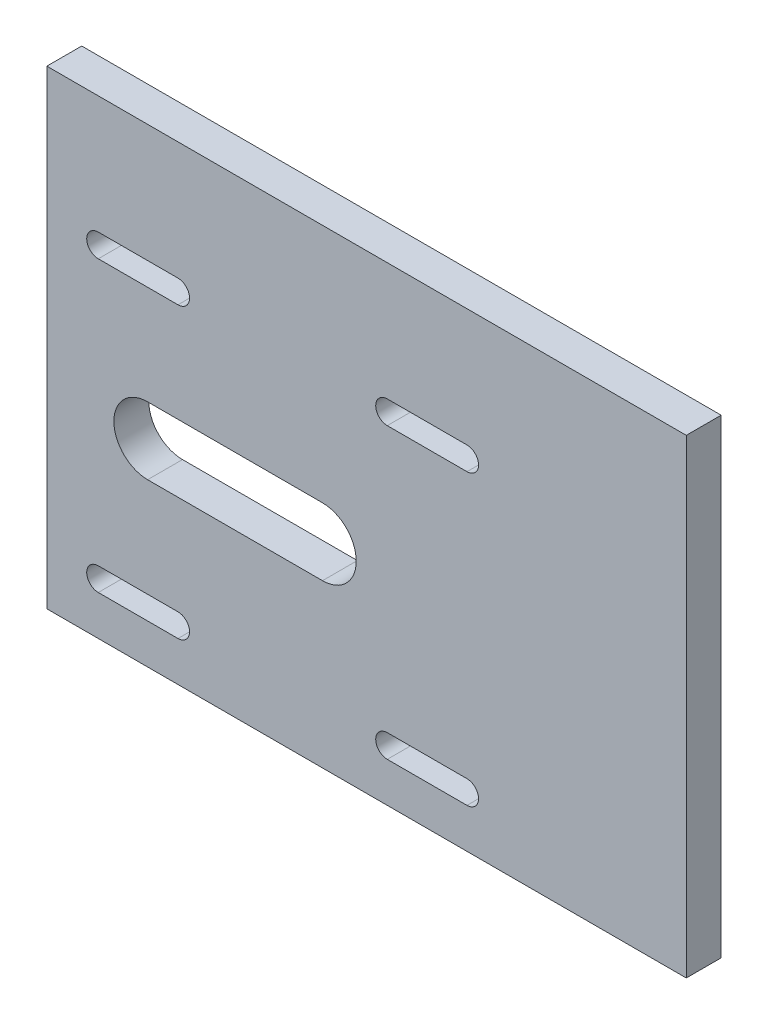
ISO-10303-21;
HEADER;
FILE_DESCRIPTION(('STEP AP214'),'2;1');
FILE_NAME('part.step','',(''),(''),'','','');
FILE_SCHEMA(('AUTOMOTIVE_DESIGN { 1 0 10303 214 1 1 1 1 }'));
ENDSEC;
DATA;
#1=APPLICATION_CONTEXT('core data for automotive mechanical design processes');
#2=APPLICATION_PROTOCOL_DEFINITION('international standard','automotive_design',2000,#1);
#3=PRODUCT_CONTEXT('',#1,'mechanical');
#4=PRODUCT('Part','Part','',(#3));
#5=PRODUCT_RELATED_PRODUCT_CATEGORY('part','',(#4));
#6=PRODUCT_DEFINITION_FORMATION('','',#4);
#7=PRODUCT_DEFINITION_CONTEXT('part definition',#1,'design');
#8=PRODUCT_DEFINITION('design','',#6,#7);
#9=PRODUCT_DEFINITION_SHAPE('','',#8);
#10=(LENGTH_UNIT() NAMED_UNIT(*) SI_UNIT(.MILLI.,.METRE.));
#11=(NAMED_UNIT(*) PLANE_ANGLE_UNIT() SI_UNIT($,.RADIAN.));
#12=(NAMED_UNIT(*) SI_UNIT($,.STERADIAN.) SOLID_ANGLE_UNIT());
#13=UNCERTAINTY_MEASURE_WITH_UNIT(LENGTH_MEASURE(1.E-05),#10,'distance_accuracy_value','');
#14=(GEOMETRIC_REPRESENTATION_CONTEXT(3) GLOBAL_UNCERTAINTY_ASSIGNED_CONTEXT((#13)) GLOBAL_UNIT_ASSIGNED_CONTEXT((#10,
#11,#12)) REPRESENTATION_CONTEXT('',''));
#15=CARTESIAN_POINT('',(0.,0.,0.));
#16=DIRECTION('',(0.,0.,1.));
#17=DIRECTION('',(1.,0.,0.));
#18=AXIS2_PLACEMENT_3D('',#15,#16,#17);
#19=CARTESIAN_POINT('',(0.,0.,11.1125));
#20=DIRECTION('',(0.,0.,-1.));
#21=DIRECTION('',(-1.,0.,0.));
#22=AXIS2_PLACEMENT_3D('',#19,#20,#21);
#23=PLANE('',#22);
#24=CARTESIAN_POINT('',(-150.699186737355,-101.903813262693,11.1125));
#25=DIRECTION('',(0.,0.,1.));
#26=DIRECTION('',(1.,0.,0.));
#27=AXIS2_PLACEMENT_3D('',#24,#25,#26);
#28=CIRCLE('',#27,3.68300000000001);
#29=CARTESIAN_POINT('',(-150.699186737355,-105.586813262693,11.1125));
#30=VERTEX_POINT('',#29);
#31=CARTESIAN_POINT('',(-150.699186737355,-98.2208132626931,11.1125));
#32=VERTEX_POINT('',#31);
#33=EDGE_CURVE('E236',#30,#32,#28,.T.);
#34=ORIENTED_EDGE('',*,*,#33,.F.);
#35=DIRECTION('',(1.,0.,0.));
#36=VECTOR('',#35,1.);
#37=CARTESIAN_POINT('',(-150.699186737355,-105.586813262693,11.1125));
#38=LINE('',#37,#36);
#39=CARTESIAN_POINT('',(-176.099186737355,-105.586813262693,11.1125));
#40=VERTEX_POINT('',#39);
#41=EDGE_CURVE('E244',#40,#30,#38,.T.);
#42=ORIENTED_EDGE('',*,*,#41,.F.);
#43=CARTESIAN_POINT('',(-176.099186737355,-101.903813262693,11.1125));
#44=DIRECTION('',(0.,0.,1.));
#45=DIRECTION('',(1.,0.,0.));
#46=AXIS2_PLACEMENT_3D('',#43,#44,#45);
#47=CIRCLE('',#46,3.68300000000001);
#48=CARTESIAN_POINT('',(-176.099186737355,-98.2208132626931,11.1125));
#49=VERTEX_POINT('',#48);
#50=EDGE_CURVE('E241',#49,#40,#47,.T.);
#51=ORIENTED_EDGE('',*,*,#50,.F.);
#52=DIRECTION('',(-1.,0.,0.));
#53=VECTOR('',#52,1.);
#54=CARTESIAN_POINT('',(-150.699186737355,-98.2208132626931,11.1125));
#55=LINE('',#54,#53);
#56=EDGE_CURVE('E238',#32,#49,#55,.T.);
#57=ORIENTED_EDGE('',*,*,#56,.F.);
#58=EDGE_LOOP('',(#34,#42,#51,#57));
#59=FACE_BOUND('',#58,.T.);
#60=CARTESIAN_POINT('',(-242.774186737355,-9.82881326269314,11.1125));
#61=DIRECTION('',(0.,0.,1.));
#62=DIRECTION('',(1.,0.,0.));
#63=AXIS2_PLACEMENT_3D('',#60,#61,#62);
#64=CIRCLE('',#63,3.68300000000002);
#65=CARTESIAN_POINT('',(-242.774186737355,-13.5118132626932,11.1125));
#66=VERTEX_POINT('',#65);
#67=CARTESIAN_POINT('',(-242.774186737355,-6.14581326269312,11.1125));
#68=VERTEX_POINT('',#67);
#69=EDGE_CURVE('E298',#66,#68,#64,.T.);
#70=ORIENTED_EDGE('',*,*,#69,.F.);
#71=DIRECTION('',(1.,0.,0.));
#72=VECTOR('',#71,1.);
#73=CARTESIAN_POINT('',(-242.774186737355,-13.5118132626932,11.1125));
#74=LINE('',#73,#72);
#75=CARTESIAN_POINT('',(-268.174186737355,-13.5118132626932,11.1125));
#76=VERTEX_POINT('',#75);
#77=EDGE_CURVE('E306',#76,#66,#74,.T.);
#78=ORIENTED_EDGE('',*,*,#77,.F.);
#79=CARTESIAN_POINT('',(-268.174186737355,-9.82881326269315,11.1125));
#80=DIRECTION('',(0.,0.,1.));
#81=DIRECTION('',(1.,0.,0.));
#82=AXIS2_PLACEMENT_3D('',#79,#80,#81);
#83=CIRCLE('',#82,3.68300000000002);
#84=CARTESIAN_POINT('',(-268.174186737355,-6.14581326269313,11.1125));
#85=VERTEX_POINT('',#84);
#86=EDGE_CURVE('E303',#85,#76,#83,.T.);
#87=ORIENTED_EDGE('',*,*,#86,.F.);
#88=DIRECTION('',(-1.,0.,0.));
#89=VECTOR('',#88,1.);
#90=CARTESIAN_POINT('',(-242.774186737355,-6.14581326269312,11.1125));
#91=LINE('',#90,#89);
#92=EDGE_CURVE('E300',#68,#85,#91,.T.);
#93=ORIENTED_EDGE('',*,*,#92,.F.);
#94=EDGE_LOOP('',(#70,#78,#87,#93));
#95=FACE_BOUND('',#94,.T.);
#96=DIRECTION('',(0.,1.,0.));
#97=VECTOR('',#96,1.);
#98=CARTESIAN_POINT('',(-80.8354999999961,31.4461867373068,11.1125));
#99=LINE('',#98,#97);
#100=CARTESIAN_POINT('',(-80.8354999999961,-118.286813262693,11.1125));
#101=VERTEX_POINT('',#100);
#102=CARTESIAN_POINT('',(-80.8354999999961,31.4461867373068,11.1125));
#103=VERTEX_POINT('',#102);
#104=EDGE_CURVE('E360',#101,#103,#99,.T.);
#105=ORIENTED_EDGE('',*,*,#104,.T.);
#106=DIRECTION('',(-1.,0.,0.));
#107=VECTOR('',#106,1.);
#108=CARTESIAN_POINT('',(-80.8354999999961,31.4461867373068,11.1125));
#109=LINE('',#108,#107);
#110=CARTESIAN_POINT('',(-284.557186737355,31.4461867373068,11.1125));
#111=VERTEX_POINT('',#110);
#112=EDGE_CURVE('E363',#103,#111,#109,.T.);
#113=ORIENTED_EDGE('',*,*,#112,.T.);
#114=DIRECTION('',(0.,-1.,0.));
#115=VECTOR('',#114,1.);
#116=CARTESIAN_POINT('',(-284.557186737355,31.4461867373068,11.1125));
#117=LINE('',#116,#115);
#118=CARTESIAN_POINT('',(-284.557186737355,-118.286813262693,11.1125));
#119=VERTEX_POINT('',#118);
#120=EDGE_CURVE('E366',#111,#119,#117,.T.);
#121=ORIENTED_EDGE('',*,*,#120,.T.);
#122=DIRECTION('',(1.,0.,0.));
#123=VECTOR('',#122,1.);
#124=CARTESIAN_POINT('',(-80.8354999999961,-118.286813262693,11.1125));
#125=LINE('',#124,#123);
#126=EDGE_CURVE('E368',#119,#101,#125,.T.);
#127=ORIENTED_EDGE('',*,*,#126,.T.);
#128=EDGE_LOOP('',(#105,#113,#121,#127));
#129=FACE_BOUND('',#128,.T.);
#130=CARTESIAN_POINT('',(-242.774186737355,-101.903813262693,11.1125));
#131=DIRECTION('',(0.,0.,1.));
#132=DIRECTION('',(1.,0.,0.));
#133=AXIS2_PLACEMENT_3D('',#130,#131,#132);
#134=CIRCLE('',#133,3.68300000000003);
#135=CARTESIAN_POINT('',(-242.774186737355,-105.586813262693,11.1125));
#136=VERTEX_POINT('',#135);
#137=CARTESIAN_POINT('',(-242.774186737355,-98.2208132626931,11.1125));
#138=VERTEX_POINT('',#137);
#139=EDGE_CURVE('E329',#136,#138,#134,.T.);
#140=ORIENTED_EDGE('',*,*,#139,.F.);
#141=DIRECTION('',(1.,0.,0.));
#142=VECTOR('',#141,1.);
#143=CARTESIAN_POINT('',(-242.774186737355,-105.586813262693,11.1125));
#144=LINE('',#143,#142);
#145=CARTESIAN_POINT('',(-268.174186737355,-105.586813262693,11.1125));
#146=VERTEX_POINT('',#145);
#147=EDGE_CURVE('E337',#146,#136,#144,.T.);
#148=ORIENTED_EDGE('',*,*,#147,.F.);
#149=CARTESIAN_POINT('',(-268.174186737355,-101.903813262693,11.1125));
#150=DIRECTION('',(0.,0.,1.));
#151=DIRECTION('',(1.,0.,0.));
#152=AXIS2_PLACEMENT_3D('',#149,#150,#151);
#153=CIRCLE('',#152,3.68300000000001);
#154=CARTESIAN_POINT('',(-268.174186737355,-98.2208132626932,11.1125));
#155=VERTEX_POINT('',#154);
#156=EDGE_CURVE('E334',#155,#146,#153,.T.);
#157=ORIENTED_EDGE('',*,*,#156,.F.);
#158=DIRECTION('',(-1.,0.,0.));
#159=VECTOR('',#158,1.);
#160=CARTESIAN_POINT('',(-242.774186737355,-98.2208132626931,11.1125));
#161=LINE('',#160,#159);
#162=EDGE_CURVE('E331',#138,#155,#161,.T.);
#163=ORIENTED_EDGE('',*,*,#162,.F.);
#164=EDGE_LOOP('',(#140,#148,#157,#163));
#165=FACE_BOUND('',#164,.T.);
#166=CARTESIAN_POINT('',(-150.699186737355,-9.82881326269314,11.1125));
#167=DIRECTION('',(0.,0.,1.));
#168=DIRECTION('',(1.,0.,0.));
#169=AXIS2_PLACEMENT_3D('',#166,#167,#168);
#170=CIRCLE('',#169,3.68300000000002);
#171=CARTESIAN_POINT('',(-150.699186737355,-13.5118132626931,11.1125));
#172=VERTEX_POINT('',#171);
#173=CARTESIAN_POINT('',(-150.699186737355,-6.14581326269311,11.1125));
#174=VERTEX_POINT('',#173);
#175=EDGE_CURVE('E267',#172,#174,#170,.T.);
#176=ORIENTED_EDGE('',*,*,#175,.F.);
#177=DIRECTION('',(1.,0.,0.));
#178=VECTOR('',#177,1.);
#179=CARTESIAN_POINT('',(-150.699186737355,-13.5118132626931,11.1125));
#180=LINE('',#179,#178);
#181=CARTESIAN_POINT('',(-176.099186737355,-13.5118132626932,11.1125));
#182=VERTEX_POINT('',#181);
#183=EDGE_CURVE('E275',#182,#172,#180,.T.);
#184=ORIENTED_EDGE('',*,*,#183,.F.);
#185=CARTESIAN_POINT('',(-176.099186737355,-9.82881326269313,11.1125));
#186=DIRECTION('',(0.,0.,1.));
#187=DIRECTION('',(1.,0.,0.));
#188=AXIS2_PLACEMENT_3D('',#185,#186,#187);
#189=CIRCLE('',#188,3.68300000000002);
#190=CARTESIAN_POINT('',(-176.099186737355,-6.14581326269311,11.1125));
#191=VERTEX_POINT('',#190);
#192=EDGE_CURVE('E272',#191,#182,#189,.T.);
#193=ORIENTED_EDGE('',*,*,#192,.F.);
#194=DIRECTION('',(-1.,0.,0.));
#195=VECTOR('',#194,1.);
#196=CARTESIAN_POINT('',(-150.699186737355,-6.14581326269311,11.1125));
#197=LINE('',#196,#195);
#198=EDGE_CURVE('E269',#174,#191,#197,.T.);
#199=ORIENTED_EDGE('',*,*,#198,.F.);
#200=EDGE_LOOP('',(#176,#184,#193,#199));
#201=FACE_BOUND('',#200,.T.);
#202=CARTESIAN_POINT('',(-196.736686737355,-55.8663132626931,11.1125));
#203=DIRECTION('',(0.,0.,1.));
#204=DIRECTION('',(1.,0.,0.));
#205=AXIS2_PLACEMENT_3D('',#202,#203,#204);
#206=CIRCLE('',#205,10.7443561698254);
#207=CARTESIAN_POINT('',(-196.736686737355,-66.6106694325185,11.1125));
#208=VERTEX_POINT('',#207);
#209=CARTESIAN_POINT('',(-196.736686737355,-45.1219570928678,11.1125));
#210=VERTEX_POINT('',#209);
#211=EDGE_CURVE('E200',#208,#210,#206,.T.);
#212=ORIENTED_EDGE('',*,*,#211,.F.);
#213=DIRECTION('',(1.,0.,0.));
#214=VECTOR('',#213,1.);
#215=CARTESIAN_POINT('',(-196.736686737355,-66.6106694325185,11.1125));
#216=LINE('',#215,#214);
#217=CARTESIAN_POINT('',(-252.452295744129,-66.6106694325185,11.1125));
#218=VERTEX_POINT('',#217);
#219=EDGE_CURVE('E222',#218,#208,#216,.T.);
#220=ORIENTED_EDGE('',*,*,#219,.F.);
#221=CARTESIAN_POINT('',(-252.452295744129,-55.8663132626931,11.1125));
#222=DIRECTION('',(0.,0.,1.));
#223=DIRECTION('',(1.,0.,0.));
#224=AXIS2_PLACEMENT_3D('',#221,#222,#223);
#225=CIRCLE('',#224,10.7443561698254);
#226=CARTESIAN_POINT('',(-252.452295744129,-45.1219570928678,11.1125));
#227=VERTEX_POINT('',#226);
#228=EDGE_CURVE('E220',#227,#218,#225,.T.);
#229=ORIENTED_EDGE('',*,*,#228,.F.);
#230=DIRECTION('',(-1.,0.,0.));
#231=VECTOR('',#230,1.);
#232=CARTESIAN_POINT('',(-196.736686737355,-45.1219570928678,11.1125));
#233=LINE('',#232,#231);
#234=EDGE_CURVE('E208',#210,#227,#233,.T.);
#235=ORIENTED_EDGE('',*,*,#234,.F.);
#236=EDGE_LOOP('',(#212,#220,#229,#235));
#237=FACE_BOUND('',#236,.T.);
#238=ADVANCED_FACE('F39',(#59,#95,#129,#165,#201,#237),#23,.F.);
#239=CARTESIAN_POINT('',(0.,0.,0.));
#240=DIRECTION('',(0.,0.,-1.));
#241=DIRECTION('',(-1.,0.,0.));
#242=AXIS2_PLACEMENT_3D('',#239,#240,#241);
#243=PLANE('',#242);
#244=DIRECTION('',(0.,1.,0.));
#245=VECTOR('',#244,1.);
#246=CARTESIAN_POINT('',(-80.8354999999961,31.4461867373068,0.));
#247=LINE('',#246,#245);
#248=CARTESIAN_POINT('',(-80.8354999999961,-118.286813262693,0.));
#249=VERTEX_POINT('',#248);
#250=CARTESIAN_POINT('',(-80.8354999999961,31.4461867373068,0.));
#251=VERTEX_POINT('',#250);
#252=EDGE_CURVE('E359',#249,#251,#247,.T.);
#253=ORIENTED_EDGE('',*,*,#252,.F.);
#254=DIRECTION('',(1.,0.,0.));
#255=VECTOR('',#254,1.);
#256=CARTESIAN_POINT('',(-80.8354999999961,-118.286813262693,0.));
#257=LINE('',#256,#255);
#258=CARTESIAN_POINT('',(-284.557186737355,-118.286813262693,0.));
#259=VERTEX_POINT('',#258);
#260=EDGE_CURVE('E364',#259,#249,#257,.T.);
#261=ORIENTED_EDGE('',*,*,#260,.F.);
#262=DIRECTION('',(0.,-1.,0.));
#263=VECTOR('',#262,1.);
#264=CARTESIAN_POINT('',(-284.557186737355,31.4461867373068,0.));
#265=LINE('',#264,#263);
#266=CARTESIAN_POINT('',(-284.557186737355,31.4461867373068,0.));
#267=VERTEX_POINT('',#266);
#268=EDGE_CURVE('E375',#267,#259,#265,.T.);
#269=ORIENTED_EDGE('',*,*,#268,.F.);
#270=DIRECTION('',(-1.,0.,0.));
#271=VECTOR('',#270,1.);
#272=CARTESIAN_POINT('',(-80.8354999999961,31.4461867373068,0.));
#273=LINE('',#272,#271);
#274=EDGE_CURVE('E373',#251,#267,#273,.T.);
#275=ORIENTED_EDGE('',*,*,#274,.F.);
#276=EDGE_LOOP('',(#253,#261,#269,#275));
#277=FACE_BOUND('',#276,.T.);
#278=DIRECTION('',(1.,0.,0.));
#279=VECTOR('',#278,1.);
#280=CARTESIAN_POINT('',(-242.774186737355,-105.586813262693,0.));
#281=LINE('',#280,#279);
#282=CARTESIAN_POINT('',(-268.174186737355,-105.586813262693,0.));
#283=VERTEX_POINT('',#282);
#284=CARTESIAN_POINT('',(-242.774186737355,-105.586813262693,0.));
#285=VERTEX_POINT('',#284);
#286=EDGE_CURVE('E332',#283,#285,#281,.T.);
#287=ORIENTED_EDGE('',*,*,#286,.T.);
#288=CARTESIAN_POINT('',(-242.774186737355,-101.903813262693,0.));
#289=DIRECTION('',(0.,0.,1.));
#290=DIRECTION('',(1.,0.,0.));
#291=AXIS2_PLACEMENT_3D('',#288,#289,#290);
#292=CIRCLE('',#291,3.68300000000003);
#293=CARTESIAN_POINT('',(-242.774186737355,-98.2208132626931,0.));
#294=VERTEX_POINT('',#293);
#295=EDGE_CURVE('E328',#285,#294,#292,.T.);
#296=ORIENTED_EDGE('',*,*,#295,.T.);
#297=DIRECTION('',(-1.,0.,0.));
#298=VECTOR('',#297,1.);
#299=CARTESIAN_POINT('',(-242.774186737355,-98.2208132626931,0.));
#300=LINE('',#299,#298);
#301=CARTESIAN_POINT('',(-268.174186737355,-98.2208132626932,0.));
#302=VERTEX_POINT('',#301);
#303=EDGE_CURVE('E342',#294,#302,#300,.T.);
#304=ORIENTED_EDGE('',*,*,#303,.T.);
#305=CARTESIAN_POINT('',(-268.174186737355,-101.903813262693,0.));
#306=DIRECTION('',(0.,0.,1.));
#307=DIRECTION('',(1.,0.,0.));
#308=AXIS2_PLACEMENT_3D('',#305,#306,#307);
#309=CIRCLE('',#308,3.68300000000001);
#310=EDGE_CURVE('E345',#302,#283,#309,.T.);
#311=ORIENTED_EDGE('',*,*,#310,.T.);
#312=EDGE_LOOP('',(#287,#296,#304,#311));
#313=FACE_BOUND('',#312,.T.);
#314=DIRECTION('',(1.,0.,0.));
#315=VECTOR('',#314,1.);
#316=CARTESIAN_POINT('',(-242.774186737355,-13.5118132626932,0.));
#317=LINE('',#316,#315);
#318=CARTESIAN_POINT('',(-268.174186737355,-13.5118132626932,0.));
#319=VERTEX_POINT('',#318);
#320=CARTESIAN_POINT('',(-242.774186737355,-13.5118132626932,0.));
#321=VERTEX_POINT('',#320);
#322=EDGE_CURVE('E301',#319,#321,#317,.T.);
#323=ORIENTED_EDGE('',*,*,#322,.T.);
#324=CARTESIAN_POINT('',(-242.774186737355,-9.82881326269314,0.));
#325=DIRECTION('',(0.,0.,1.));
#326=DIRECTION('',(1.,0.,0.));
#327=AXIS2_PLACEMENT_3D('',#324,#325,#326);
#328=CIRCLE('',#327,3.68300000000002);
#329=CARTESIAN_POINT('',(-242.774186737355,-6.14581326269312,0.));
#330=VERTEX_POINT('',#329);
#331=EDGE_CURVE('E297',#321,#330,#328,.T.);
#332=ORIENTED_EDGE('',*,*,#331,.T.);
#333=DIRECTION('',(-1.,0.,0.));
#334=VECTOR('',#333,1.);
#335=CARTESIAN_POINT('',(-242.774186737355,-6.14581326269312,0.));
#336=LINE('',#335,#334);
#337=CARTESIAN_POINT('',(-268.174186737355,-6.14581326269313,0.));
#338=VERTEX_POINT('',#337);
#339=EDGE_CURVE('E311',#330,#338,#336,.T.);
#340=ORIENTED_EDGE('',*,*,#339,.T.);
#341=CARTESIAN_POINT('',(-268.174186737355,-9.82881326269315,0.));
#342=DIRECTION('',(0.,0.,1.));
#343=DIRECTION('',(1.,0.,0.));
#344=AXIS2_PLACEMENT_3D('',#341,#342,#343);
#345=CIRCLE('',#344,3.68300000000002);
#346=EDGE_CURVE('E314',#338,#319,#345,.T.);
#347=ORIENTED_EDGE('',*,*,#346,.T.);
#348=EDGE_LOOP('',(#323,#332,#340,#347));
#349=FACE_BOUND('',#348,.T.);
#350=DIRECTION('',(1.,0.,0.));
#351=VECTOR('',#350,1.);
#352=CARTESIAN_POINT('',(-150.699186737355,-13.5118132626931,0.));
#353=LINE('',#352,#351);
#354=CARTESIAN_POINT('',(-176.099186737355,-13.5118132626932,0.));
#355=VERTEX_POINT('',#354);
#356=CARTESIAN_POINT('',(-150.699186737355,-13.5118132626931,0.));
#357=VERTEX_POINT('',#356);
#358=EDGE_CURVE('E270',#355,#357,#353,.T.);
#359=ORIENTED_EDGE('',*,*,#358,.T.);
#360=CARTESIAN_POINT('',(-150.699186737355,-9.82881326269314,0.));
#361=DIRECTION('',(0.,0.,1.));
#362=DIRECTION('',(1.,0.,0.));
#363=AXIS2_PLACEMENT_3D('',#360,#361,#362);
#364=CIRCLE('',#363,3.68300000000002);
#365=CARTESIAN_POINT('',(-150.699186737355,-6.14581326269311,0.));
#366=VERTEX_POINT('',#365);
#367=EDGE_CURVE('E266',#357,#366,#364,.T.);
#368=ORIENTED_EDGE('',*,*,#367,.T.);
#369=DIRECTION('',(-1.,0.,0.));
#370=VECTOR('',#369,1.);
#371=CARTESIAN_POINT('',(-150.699186737355,-6.14581326269311,0.));
#372=LINE('',#371,#370);
#373=CARTESIAN_POINT('',(-176.099186737355,-6.14581326269311,0.));
#374=VERTEX_POINT('',#373);
#375=EDGE_CURVE('E280',#366,#374,#372,.T.);
#376=ORIENTED_EDGE('',*,*,#375,.T.);
#377=CARTESIAN_POINT('',(-176.099186737355,-9.82881326269313,0.));
#378=DIRECTION('',(0.,0.,1.));
#379=DIRECTION('',(1.,0.,0.));
#380=AXIS2_PLACEMENT_3D('',#377,#378,#379);
#381=CIRCLE('',#380,3.68300000000002);
#382=EDGE_CURVE('E283',#374,#355,#381,.T.);
#383=ORIENTED_EDGE('',*,*,#382,.T.);
#384=EDGE_LOOP('',(#359,#368,#376,#383));
#385=FACE_BOUND('',#384,.T.);
#386=DIRECTION('',(1.,0.,0.));
#387=VECTOR('',#386,1.);
#388=CARTESIAN_POINT('',(-150.699186737355,-105.586813262693,0.));
#389=LINE('',#388,#387);
#390=CARTESIAN_POINT('',(-176.099186737355,-105.586813262693,0.));
#391=VERTEX_POINT('',#390);
#392=CARTESIAN_POINT('',(-150.699186737355,-105.586813262693,0.));
#393=VERTEX_POINT('',#392);
#394=EDGE_CURVE('E239',#391,#393,#389,.T.);
#395=ORIENTED_EDGE('',*,*,#394,.T.);
#396=CARTESIAN_POINT('',(-150.699186737355,-101.903813262693,0.));
#397=DIRECTION('',(0.,0.,1.));
#398=DIRECTION('',(1.,0.,0.));
#399=AXIS2_PLACEMENT_3D('',#396,#397,#398);
#400=CIRCLE('',#399,3.68300000000001);
#401=CARTESIAN_POINT('',(-150.699186737355,-98.2208132626931,0.));
#402=VERTEX_POINT('',#401);
#403=EDGE_CURVE('E216',#393,#402,#400,.T.);
#404=ORIENTED_EDGE('',*,*,#403,.T.);
#405=DIRECTION('',(-1.,0.,0.));
#406=VECTOR('',#405,1.);
#407=CARTESIAN_POINT('',(-150.699186737355,-98.2208132626931,0.));
#408=LINE('',#407,#406);
#409=CARTESIAN_POINT('',(-176.099186737355,-98.2208132626931,0.));
#410=VERTEX_POINT('',#409);
#411=EDGE_CURVE('E249',#402,#410,#408,.T.);
#412=ORIENTED_EDGE('',*,*,#411,.T.);
#413=CARTESIAN_POINT('',(-176.099186737355,-101.903813262693,0.));
#414=DIRECTION('',(0.,0.,1.));
#415=DIRECTION('',(1.,0.,0.));
#416=AXIS2_PLACEMENT_3D('',#413,#414,#415);
#417=CIRCLE('',#416,3.68300000000001);
#418=EDGE_CURVE('E252',#410,#391,#417,.T.);
#419=ORIENTED_EDGE('',*,*,#418,.T.);
#420=EDGE_LOOP('',(#395,#404,#412,#419));
#421=FACE_BOUND('',#420,.T.);
#422=DIRECTION('',(1.,0.,0.));
#423=VECTOR('',#422,1.);
#424=CARTESIAN_POINT('',(-196.736686737355,-66.6106694325185,0.));
#425=LINE('',#424,#423);
#426=CARTESIAN_POINT('',(-252.452295744129,-66.6106694325185,0.));
#427=VERTEX_POINT('',#426);
#428=CARTESIAN_POINT('',(-196.736686737355,-66.6106694325185,0.));
#429=VERTEX_POINT('',#428);
#430=EDGE_CURVE('E209',#427,#429,#425,.T.);
#431=ORIENTED_EDGE('',*,*,#430,.T.);
#432=CARTESIAN_POINT('',(-196.736686737355,-55.8663132626931,0.));
#433=DIRECTION('',(0.,0.,1.));
#434=DIRECTION('',(1.,0.,0.));
#435=AXIS2_PLACEMENT_3D('',#432,#433,#434);
#436=CIRCLE('',#435,10.7443561698254);
#437=CARTESIAN_POINT('',(-196.736686737355,-45.1219570928678,0.));
#438=VERTEX_POINT('',#437);
#439=EDGE_CURVE('E62',#429,#438,#436,.T.);
#440=ORIENTED_EDGE('',*,*,#439,.T.);
#441=DIRECTION('',(-1.,0.,0.));
#442=VECTOR('',#441,1.);
#443=CARTESIAN_POINT('',(-196.736686737355,-45.1219570928678,0.));
#444=LINE('',#443,#442);
#445=CARTESIAN_POINT('',(-252.452295744129,-45.1219570928678,0.));
#446=VERTEX_POINT('',#445);
#447=EDGE_CURVE('E215',#438,#446,#444,.T.);
#448=ORIENTED_EDGE('',*,*,#447,.T.);
#449=CARTESIAN_POINT('',(-252.452295744129,-55.8663132626931,0.));
#450=DIRECTION('',(0.,0.,1.));
#451=DIRECTION('',(1.,0.,0.));
#452=AXIS2_PLACEMENT_3D('',#449,#450,#451);
#453=CIRCLE('',#452,10.7443561698254);
#454=EDGE_CURVE('E228',#446,#427,#453,.T.);
#455=ORIENTED_EDGE('',*,*,#454,.T.);
#456=EDGE_LOOP('',(#431,#440,#448,#455));
#457=FACE_BOUND('',#456,.T.);
#458=ADVANCED_FACE('F393',(#277,#313,#349,#385,#421,#457),#243,.T.);
#459=CARTESIAN_POINT('',(-80.8354999999961,31.4461867373068,11.1125));
#460=DIRECTION('',(-1.,0.,0.));
#461=DIRECTION('',(0.,-1.,0.));
#462=AXIS2_PLACEMENT_3D('',#459,#460,#461);
#463=PLANE('',#462);
#464=ORIENTED_EDGE('',*,*,#252,.T.);
#465=DIRECTION('',(0.,0.,-1.));
#466=VECTOR('',#465,1.);
#467=CARTESIAN_POINT('',(-80.8354999999961,31.4461867373068,11.1125));
#468=LINE('',#467,#466);
#469=EDGE_CURVE('E11',#103,#251,#468,.T.);
#470=ORIENTED_EDGE('',*,*,#469,.F.);
#471=ORIENTED_EDGE('',*,*,#104,.F.);
#472=DIRECTION('',(0.,0.,-1.));
#473=VECTOR('',#472,1.);
#474=CARTESIAN_POINT('',(-80.8354999999961,-118.286813262693,11.1125));
#475=LINE('',#474,#473);
#476=EDGE_CURVE('E370',#101,#249,#475,.T.);
#477=ORIENTED_EDGE('',*,*,#476,.T.);
#478=EDGE_LOOP('',(#464,#470,#471,#477));
#479=FACE_BOUND('',#478,.T.);
#480=ADVANCED_FACE('F41',(#479),#463,.F.);
#481=CARTESIAN_POINT('',(-80.8354999999961,31.4461867373068,11.1125));
#482=DIRECTION('',(0.,-1.,0.));
#483=DIRECTION('',(1.,0.,0.));
#484=AXIS2_PLACEMENT_3D('',#481,#482,#483);
#485=PLANE('',#484);
#486=ORIENTED_EDGE('',*,*,#274,.T.);
#487=DIRECTION('',(0.,0.,-1.));
#488=VECTOR('',#487,1.);
#489=CARTESIAN_POINT('',(-284.557186737355,31.4461867373068,11.1125));
#490=LINE('',#489,#488);
#491=EDGE_CURVE('E47',#111,#267,#490,.T.);
#492=ORIENTED_EDGE('',*,*,#491,.F.);
#493=ORIENTED_EDGE('',*,*,#112,.F.);
#494=ORIENTED_EDGE('',*,*,#469,.T.);
#495=EDGE_LOOP('',(#486,#492,#493,#494));
#496=FACE_BOUND('',#495,.T.);
#497=ADVANCED_FACE('F404',(#496),#485,.F.);
#498=CARTESIAN_POINT('',(-284.557186737355,31.4461867373068,11.1125));
#499=DIRECTION('',(1.,0.,0.));
#500=DIRECTION('',(0.,0.,-1.));
#501=AXIS2_PLACEMENT_3D('',#498,#499,#500);
#502=PLANE('',#501);
#503=ORIENTED_EDGE('',*,*,#268,.T.);
#504=DIRECTION('',(0.,0.,-1.));
#505=VECTOR('',#504,1.);
#506=CARTESIAN_POINT('',(-284.557186737355,-118.286813262693,11.1125));
#507=LINE('',#506,#505);
#508=EDGE_CURVE('E380',#119,#259,#507,.T.);
#509=ORIENTED_EDGE('',*,*,#508,.F.);
#510=ORIENTED_EDGE('',*,*,#120,.F.);
#511=ORIENTED_EDGE('',*,*,#491,.T.);
#512=EDGE_LOOP('',(#503,#509,#510,#511));
#513=FACE_BOUND('',#512,.T.);
#514=ADVANCED_FACE('F387',(#513),#502,.F.);
#515=CARTESIAN_POINT('',(-80.8354999999961,-118.286813262693,11.1125));
#516=DIRECTION('',(0.,1.,0.));
#517=DIRECTION('',(-1.,0.,0.));
#518=AXIS2_PLACEMENT_3D('',#515,#516,#517);
#519=PLANE('',#518);
#520=ORIENTED_EDGE('',*,*,#260,.T.);
#521=ORIENTED_EDGE('',*,*,#476,.F.);
#522=ORIENTED_EDGE('',*,*,#126,.F.);
#523=ORIENTED_EDGE('',*,*,#508,.T.);
#524=EDGE_LOOP('',(#520,#521,#522,#523));
#525=FACE_BOUND('',#524,.T.);
#526=ADVANCED_FACE('F397',(#525),#519,.F.);
#527=CARTESIAN_POINT('',(-242.774186737355,-101.903813262693,11.1125));
#528=DIRECTION('',(0.,0.,-1.));
#529=DIRECTION('',(-1.,0.,0.));
#530=AXIS2_PLACEMENT_3D('',#527,#528,#529);
#531=CYLINDRICAL_SURFACE('',#530,3.68300000000003);
#532=ORIENTED_EDGE('',*,*,#295,.F.);
#533=DIRECTION('',(0.,0.,-1.));
#534=VECTOR('',#533,1.);
#535=CARTESIAN_POINT('',(-242.774186737355,-105.586813262693,11.1125));
#536=LINE('',#535,#534);
#537=EDGE_CURVE('E339',#136,#285,#536,.T.);
#538=ORIENTED_EDGE('',*,*,#537,.F.);
#539=ORIENTED_EDGE('',*,*,#139,.T.);
#540=DIRECTION('',(0.,0.,-1.));
#541=VECTOR('',#540,1.);
#542=CARTESIAN_POINT('',(-242.774186737355,-98.2208132626931,11.1125));
#543=LINE('',#542,#541);
#544=EDGE_CURVE('E356',#138,#294,#543,.T.);
#545=ORIENTED_EDGE('',*,*,#544,.T.);
#546=EDGE_LOOP('',(#532,#538,#539,#545));
#547=FACE_BOUND('',#546,.T.);
#548=ADVANCED_FACE('F421',(#547),#531,.F.);
#549=CARTESIAN_POINT('',(-242.774186737355,-98.2208132626931,11.1125));
#550=DIRECTION('',(0.,-1.,0.));
#551=DIRECTION('',(1.,0.,0.));
#552=AXIS2_PLACEMENT_3D('',#549,#550,#551);
#553=PLANE('',#552);
#554=ORIENTED_EDGE('',*,*,#303,.F.);
#555=ORIENTED_EDGE('',*,*,#544,.F.);
#556=ORIENTED_EDGE('',*,*,#162,.T.);
#557=DIRECTION('',(0.,0.,-1.));
#558=VECTOR('',#557,1.);
#559=CARTESIAN_POINT('',(-268.174186737355,-98.2208132626932,11.1125));
#560=LINE('',#559,#558);
#561=EDGE_CURVE('E354',#155,#302,#560,.T.);
#562=ORIENTED_EDGE('',*,*,#561,.T.);
#563=EDGE_LOOP('',(#554,#555,#556,#562));
#564=FACE_BOUND('',#563,.T.);
#565=ADVANCED_FACE('F428',(#564),#553,.T.);
#566=CARTESIAN_POINT('',(-268.174186737355,-101.903813262693,11.1125));
#567=DIRECTION('',(0.,0.,-1.));
#568=DIRECTION('',(-1.,0.,0.));
#569=AXIS2_PLACEMENT_3D('',#566,#567,#568);
#570=CYLINDRICAL_SURFACE('',#569,3.68300000000001);
#571=ORIENTED_EDGE('',*,*,#310,.F.);
#572=ORIENTED_EDGE('',*,*,#561,.F.);
#573=ORIENTED_EDGE('',*,*,#156,.T.);
#574=DIRECTION('',(0.,0.,-1.));
#575=VECTOR('',#574,1.);
#576=CARTESIAN_POINT('',(-268.174186737355,-105.586813262693,11.1125));
#577=LINE('',#576,#575);
#578=EDGE_CURVE('E352',#146,#283,#577,.T.);
#579=ORIENTED_EDGE('',*,*,#578,.T.);
#580=EDGE_LOOP('',(#571,#572,#573,#579));
#581=FACE_BOUND('',#580,.T.);
#582=ADVANCED_FACE('F433',(#581),#570,.F.);
#583=CARTESIAN_POINT('',(-242.774186737355,-105.586813262693,11.1125));
#584=DIRECTION('',(0.,1.,0.));
#585=DIRECTION('',(-1.,0.,0.));
#586=AXIS2_PLACEMENT_3D('',#583,#584,#585);
#587=PLANE('',#586);
#588=ORIENTED_EDGE('',*,*,#286,.F.);
#589=ORIENTED_EDGE('',*,*,#578,.F.);
#590=ORIENTED_EDGE('',*,*,#147,.T.);
#591=ORIENTED_EDGE('',*,*,#537,.T.);
#592=EDGE_LOOP('',(#588,#589,#590,#591));
#593=FACE_BOUND('',#592,.T.);
#594=ADVANCED_FACE('F440',(#593),#587,.T.);
#595=CARTESIAN_POINT('',(-242.774186737355,-9.82881326269314,11.1125));
#596=DIRECTION('',(0.,0.,-1.));
#597=DIRECTION('',(-1.,0.,0.));
#598=AXIS2_PLACEMENT_3D('',#595,#596,#597);
#599=CYLINDRICAL_SURFACE('',#598,3.68300000000002);
#600=ORIENTED_EDGE('',*,*,#331,.F.);
#601=DIRECTION('',(0.,0.,-1.));
#602=VECTOR('',#601,1.);
#603=CARTESIAN_POINT('',(-242.774186737355,-13.5118132626932,11.1125));
#604=LINE('',#603,#602);
#605=EDGE_CURVE('E308',#66,#321,#604,.T.);
#606=ORIENTED_EDGE('',*,*,#605,.F.);
#607=ORIENTED_EDGE('',*,*,#69,.T.);
#608=DIRECTION('',(0.,0.,-1.));
#609=VECTOR('',#608,1.);
#610=CARTESIAN_POINT('',(-242.774186737355,-6.14581326269312,11.1125));
#611=LINE('',#610,#609);
#612=EDGE_CURVE('E325',#68,#330,#611,.T.);
#613=ORIENTED_EDGE('',*,*,#612,.T.);
#614=EDGE_LOOP('',(#600,#606,#607,#613));
#615=FACE_BOUND('',#614,.T.);
#616=ADVANCED_FACE('F492',(#615),#599,.F.);
#617=CARTESIAN_POINT('',(-242.774186737355,-6.14581326269312,11.1125));
#618=DIRECTION('',(0.,-1.,0.));
#619=DIRECTION('',(1.,0.,0.));
#620=AXIS2_PLACEMENT_3D('',#617,#618,#619);
#621=PLANE('',#620);
#622=ORIENTED_EDGE('',*,*,#339,.F.);
#623=ORIENTED_EDGE('',*,*,#612,.F.);
#624=ORIENTED_EDGE('',*,*,#92,.T.);
#625=DIRECTION('',(0.,0.,-1.));
#626=VECTOR('',#625,1.);
#627=CARTESIAN_POINT('',(-268.174186737355,-6.14581326269313,11.1125));
#628=LINE('',#627,#626);
#629=EDGE_CURVE('E323',#85,#338,#628,.T.);
#630=ORIENTED_EDGE('',*,*,#629,.T.);
#631=EDGE_LOOP('',(#622,#623,#624,#630));
#632=FACE_BOUND('',#631,.T.);
#633=ADVANCED_FACE('F488',(#632),#621,.T.);
#634=CARTESIAN_POINT('',(-268.174186737355,-9.82881326269315,11.1125));
#635=DIRECTION('',(0.,0.,-1.));
#636=DIRECTION('',(-1.,0.,0.));
#637=AXIS2_PLACEMENT_3D('',#634,#635,#636);
#638=CYLINDRICAL_SURFACE('',#637,3.68300000000002);
#639=ORIENTED_EDGE('',*,*,#346,.F.);
#640=ORIENTED_EDGE('',*,*,#629,.F.);
#641=ORIENTED_EDGE('',*,*,#86,.T.);
#642=DIRECTION('',(0.,0.,-1.));
#643=VECTOR('',#642,1.);
#644=CARTESIAN_POINT('',(-268.174186737355,-13.5118132626932,11.1125));
#645=LINE('',#644,#643);
#646=EDGE_CURVE('E321',#76,#319,#645,.T.);
#647=ORIENTED_EDGE('',*,*,#646,.T.);
#648=EDGE_LOOP('',(#639,#640,#641,#647));
#649=FACE_BOUND('',#648,.T.);
#650=ADVANCED_FACE('F484',(#649),#638,.F.);
#651=CARTESIAN_POINT('',(-242.774186737355,-13.5118132626932,11.1125));
#652=DIRECTION('',(0.,1.,0.));
#653=DIRECTION('',(-1.,0.,0.));
#654=AXIS2_PLACEMENT_3D('',#651,#652,#653);
#655=PLANE('',#654);
#656=ORIENTED_EDGE('',*,*,#322,.F.);
#657=ORIENTED_EDGE('',*,*,#646,.F.);
#658=ORIENTED_EDGE('',*,*,#77,.T.);
#659=ORIENTED_EDGE('',*,*,#605,.T.);
#660=EDGE_LOOP('',(#656,#657,#658,#659));
#661=FACE_BOUND('',#660,.T.);
#662=ADVANCED_FACE('F481',(#661),#655,.T.);
#663=CARTESIAN_POINT('',(-150.699186737355,-9.82881326269314,11.1125));
#664=DIRECTION('',(0.,0.,-1.));
#665=DIRECTION('',(-1.,0.,0.));
#666=AXIS2_PLACEMENT_3D('',#663,#664,#665);
#667=CYLINDRICAL_SURFACE('',#666,3.68300000000002);
#668=ORIENTED_EDGE('',*,*,#367,.F.);
#669=DIRECTION('',(0.,0.,-1.));
#670=VECTOR('',#669,1.);
#671=CARTESIAN_POINT('',(-150.699186737355,-13.5118132626931,11.1125));
#672=LINE('',#671,#670);
#673=EDGE_CURVE('E277',#172,#357,#672,.T.);
#674=ORIENTED_EDGE('',*,*,#673,.F.);
#675=ORIENTED_EDGE('',*,*,#175,.T.);
#676=DIRECTION('',(0.,0.,-1.));
#677=VECTOR('',#676,1.);
#678=CARTESIAN_POINT('',(-150.699186737355,-6.14581326269311,11.1125));
#679=LINE('',#678,#677);
#680=EDGE_CURVE('E294',#174,#366,#679,.T.);
#681=ORIENTED_EDGE('',*,*,#680,.T.);
#682=EDGE_LOOP('',(#668,#674,#675,#681));
#683=FACE_BOUND('',#682,.T.);
#684=ADVANCED_FACE('F456',(#683),#667,.F.);
#685=CARTESIAN_POINT('',(-150.699186737355,-6.14581326269311,11.1125));
#686=DIRECTION('',(0.,-1.,0.));
#687=DIRECTION('',(1.,0.,0.));
#688=AXIS2_PLACEMENT_3D('',#685,#686,#687);
#689=PLANE('',#688);
#690=ORIENTED_EDGE('',*,*,#375,.F.);
#691=ORIENTED_EDGE('',*,*,#680,.F.);
#692=ORIENTED_EDGE('',*,*,#198,.T.);
#693=DIRECTION('',(0.,0.,-1.));
#694=VECTOR('',#693,1.);
#695=CARTESIAN_POINT('',(-176.099186737355,-6.14581326269311,11.1125));
#696=LINE('',#695,#694);
#697=EDGE_CURVE('E292',#191,#374,#696,.T.);
#698=ORIENTED_EDGE('',*,*,#697,.T.);
#699=EDGE_LOOP('',(#690,#691,#692,#698));
#700=FACE_BOUND('',#699,.T.);
#701=ADVANCED_FACE('F458',(#700),#689,.T.);
#702=CARTESIAN_POINT('',(-176.099186737355,-9.82881326269313,11.1125));
#703=DIRECTION('',(0.,0.,-1.));
#704=DIRECTION('',(-1.,0.,0.));
#705=AXIS2_PLACEMENT_3D('',#702,#703,#704);
#706=CYLINDRICAL_SURFACE('',#705,3.68300000000002);
#707=ORIENTED_EDGE('',*,*,#382,.F.);
#708=ORIENTED_EDGE('',*,*,#697,.F.);
#709=ORIENTED_EDGE('',*,*,#192,.T.);
#710=DIRECTION('',(0.,0.,-1.));
#711=VECTOR('',#710,1.);
#712=CARTESIAN_POINT('',(-176.099186737355,-13.5118132626932,11.1125));
#713=LINE('',#712,#711);
#714=EDGE_CURVE('E290',#182,#355,#713,.T.);
#715=ORIENTED_EDGE('',*,*,#714,.T.);
#716=EDGE_LOOP('',(#707,#708,#709,#715));
#717=FACE_BOUND('',#716,.T.);
#718=ADVANCED_FACE('F467',(#717),#706,.F.);
#719=CARTESIAN_POINT('',(-150.699186737355,-13.5118132626931,11.1125));
#720=DIRECTION('',(0.,1.,0.));
#721=DIRECTION('',(-1.,0.,0.));
#722=AXIS2_PLACEMENT_3D('',#719,#720,#721);
#723=PLANE('',#722);
#724=ORIENTED_EDGE('',*,*,#358,.F.);
#725=ORIENTED_EDGE('',*,*,#714,.F.);
#726=ORIENTED_EDGE('',*,*,#183,.T.);
#727=ORIENTED_EDGE('',*,*,#673,.T.);
#728=EDGE_LOOP('',(#724,#725,#726,#727));
#729=FACE_BOUND('',#728,.T.);
#730=ADVANCED_FACE('F465',(#729),#723,.T.);
#731=CARTESIAN_POINT('',(-150.699186737355,-101.903813262693,11.1125));
#732=DIRECTION('',(0.,0.,-1.));
#733=DIRECTION('',(-1.,0.,0.));
#734=AXIS2_PLACEMENT_3D('',#731,#732,#733);
#735=CYLINDRICAL_SURFACE('',#734,3.68300000000001);
#736=ORIENTED_EDGE('',*,*,#403,.F.);
#737=DIRECTION('',(0.,0.,-1.));
#738=VECTOR('',#737,1.);
#739=CARTESIAN_POINT('',(-150.699186737355,-105.586813262693,11.1125));
#740=LINE('',#739,#738);
#741=EDGE_CURVE('E246',#30,#393,#740,.T.);
#742=ORIENTED_EDGE('',*,*,#741,.F.);
#743=ORIENTED_EDGE('',*,*,#33,.T.);
#744=DIRECTION('',(0.,0.,-1.));
#745=VECTOR('',#744,1.);
#746=CARTESIAN_POINT('',(-150.699186737355,-98.2208132626931,11.1125));
#747=LINE('',#746,#745);
#748=EDGE_CURVE('E263',#32,#402,#747,.T.);
#749=ORIENTED_EDGE('',*,*,#748,.T.);
#750=EDGE_LOOP('',(#736,#742,#743,#749));
#751=FACE_BOUND('',#750,.T.);
#752=ADVANCED_FACE('F474',(#751),#735,.F.);
#753=CARTESIAN_POINT('',(-150.699186737355,-98.2208132626931,11.1125));
#754=DIRECTION('',(0.,-1.,0.));
#755=DIRECTION('',(0.,0.,-1.));
#756=AXIS2_PLACEMENT_3D('',#753,#754,#755);
#757=PLANE('',#756);
#758=ORIENTED_EDGE('',*,*,#411,.F.);
#759=ORIENTED_EDGE('',*,*,#748,.F.);
#760=ORIENTED_EDGE('',*,*,#56,.T.);
#761=DIRECTION('',(0.,0.,-1.));
#762=VECTOR('',#761,1.);
#763=CARTESIAN_POINT('',(-176.099186737355,-98.2208132626931,11.1125));
#764=LINE('',#763,#762);
#765=EDGE_CURVE('E261',#49,#410,#764,.T.);
#766=ORIENTED_EDGE('',*,*,#765,.T.);
#767=EDGE_LOOP('',(#758,#759,#760,#766));
#768=FACE_BOUND('',#767,.T.);
#769=ADVANCED_FACE('F559',(#768),#757,.T.);
#770=CARTESIAN_POINT('',(-176.099186737355,-101.903813262693,11.1125));
#771=DIRECTION('',(0.,0.,-1.));
#772=DIRECTION('',(-1.,0.,0.));
#773=AXIS2_PLACEMENT_3D('',#770,#771,#772);
#774=CYLINDRICAL_SURFACE('',#773,3.68300000000001);
#775=ORIENTED_EDGE('',*,*,#418,.F.);
#776=ORIENTED_EDGE('',*,*,#765,.F.);
#777=ORIENTED_EDGE('',*,*,#50,.T.);
#778=DIRECTION('',(0.,0.,-1.));
#779=VECTOR('',#778,1.);
#780=CARTESIAN_POINT('',(-176.099186737355,-105.586813262693,11.1125));
#781=LINE('',#780,#779);
#782=EDGE_CURVE('E259',#40,#391,#781,.T.);
#783=ORIENTED_EDGE('',*,*,#782,.T.);
#784=EDGE_LOOP('',(#775,#776,#777,#783));
#785=FACE_BOUND('',#784,.T.);
#786=ADVANCED_FACE('F568',(#785),#774,.F.);
#787=CARTESIAN_POINT('',(-150.699186737355,-105.586813262693,11.1125));
#788=DIRECTION('',(0.,1.,0.));
#789=DIRECTION('',(0.,0.,1.));
#790=AXIS2_PLACEMENT_3D('',#787,#788,#789);
#791=PLANE('',#790);
#792=ORIENTED_EDGE('',*,*,#394,.F.);
#793=ORIENTED_EDGE('',*,*,#782,.F.);
#794=ORIENTED_EDGE('',*,*,#41,.T.);
#795=ORIENTED_EDGE('',*,*,#741,.T.);
#796=EDGE_LOOP('',(#792,#793,#794,#795));
#797=FACE_BOUND('',#796,.T.);
#798=ADVANCED_FACE('F578',(#797),#791,.T.);
#799=CARTESIAN_POINT('',(-196.736686737355,-55.8663132626931,11.1125));
#800=DIRECTION('',(0.,0.,-1.));
#801=DIRECTION('',(-1.,0.,0.));
#802=AXIS2_PLACEMENT_3D('',#799,#800,#801);
#803=CYLINDRICAL_SURFACE('',#802,10.7443561698254);
#804=ORIENTED_EDGE('',*,*,#439,.F.);
#805=DIRECTION('',(0.,0.,-1.));
#806=VECTOR('',#805,1.);
#807=CARTESIAN_POINT('',(-196.736686737355,-66.6106694325185,11.1125));
#808=LINE('',#807,#806);
#809=EDGE_CURVE('E204',#208,#429,#808,.T.);
#810=ORIENTED_EDGE('',*,*,#809,.F.);
#811=ORIENTED_EDGE('',*,*,#211,.T.);
#812=DIRECTION('',(0.,0.,-1.));
#813=VECTOR('',#812,1.);
#814=CARTESIAN_POINT('',(-196.736686737355,-45.1219570928678,11.1125));
#815=LINE('',#814,#813);
#816=EDGE_CURVE('E203',#210,#438,#815,.T.);
#817=ORIENTED_EDGE('',*,*,#816,.T.);
#818=EDGE_LOOP('',(#804,#810,#811,#817));
#819=FACE_BOUND('',#818,.T.);
#820=ADVANCED_FACE('F202',(#819),#803,.F.);
#821=CARTESIAN_POINT('',(-196.736686737355,-45.1219570928678,11.1125));
#822=DIRECTION('',(0.,-1.,0.));
#823=DIRECTION('',(1.,0.,0.));
#824=AXIS2_PLACEMENT_3D('',#821,#822,#823);
#825=PLANE('',#824);
#826=ORIENTED_EDGE('',*,*,#447,.F.);
#827=ORIENTED_EDGE('',*,*,#816,.F.);
#828=ORIENTED_EDGE('',*,*,#234,.T.);
#829=DIRECTION('',(0.,0.,-1.));
#830=VECTOR('',#829,1.);
#831=CARTESIAN_POINT('',(-252.452295744129,-45.1219570928678,11.1125));
#832=LINE('',#831,#830);
#833=EDGE_CURVE('E217',#227,#446,#832,.T.);
#834=ORIENTED_EDGE('',*,*,#833,.T.);
#835=EDGE_LOOP('',(#826,#827,#828,#834));
#836=FACE_BOUND('',#835,.T.);
#837=ADVANCED_FACE('F212',(#836),#825,.T.);
#838=CARTESIAN_POINT('',(-252.452295744129,-55.8663132626931,11.1125));
#839=DIRECTION('',(0.,0.,-1.));
#840=DIRECTION('',(-1.,0.,0.));
#841=AXIS2_PLACEMENT_3D('',#838,#839,#840);
#842=CYLINDRICAL_SURFACE('',#841,10.7443561698254);
#843=ORIENTED_EDGE('',*,*,#454,.F.);
#844=ORIENTED_EDGE('',*,*,#833,.F.);
#845=ORIENTED_EDGE('',*,*,#228,.T.);
#846=DIRECTION('',(0.,0.,-1.));
#847=VECTOR('',#846,1.);
#848=CARTESIAN_POINT('',(-252.452295744129,-66.6106694325185,11.1125));
#849=LINE('',#848,#847);
#850=EDGE_CURVE('E54',#218,#427,#849,.T.);
#851=ORIENTED_EDGE('',*,*,#850,.T.);
#852=EDGE_LOOP('',(#843,#844,#845,#851));
#853=FACE_BOUND('',#852,.T.);
#854=ADVANCED_FACE('F605',(#853),#842,.F.);
#855=CARTESIAN_POINT('',(-196.736686737355,-66.6106694325185,11.1125));
#856=DIRECTION('',(0.,1.,0.));
#857=DIRECTION('',(0.,0.,1.));
#858=AXIS2_PLACEMENT_3D('',#855,#856,#857);
#859=PLANE('',#858);
#860=ORIENTED_EDGE('',*,*,#430,.F.);
#861=ORIENTED_EDGE('',*,*,#850,.F.);
#862=ORIENTED_EDGE('',*,*,#219,.T.);
#863=ORIENTED_EDGE('',*,*,#809,.T.);
#864=EDGE_LOOP('',(#860,#861,#862,#863));
#865=FACE_BOUND('',#864,.T.);
#866=ADVANCED_FACE('F614',(#865),#859,.T.);
#867=CLOSED_SHELL('',(#238,#458,#480,#497,#514,#526,#548,#565,#582,#594,#616,#633,#650,#662,
#684,#701,#718,#730,#752,#769,#786,#798,#820,#837,#854,#866));
#868=MANIFOLD_SOLID_BREP('B2',#867);
#869=ADVANCED_BREP_SHAPE_REPRESENTATION('',(#18,#868),#14);
#870=SHAPE_DEFINITION_REPRESENTATION(#9,#869);
ENDSEC;
END-ISO-10303-21;
